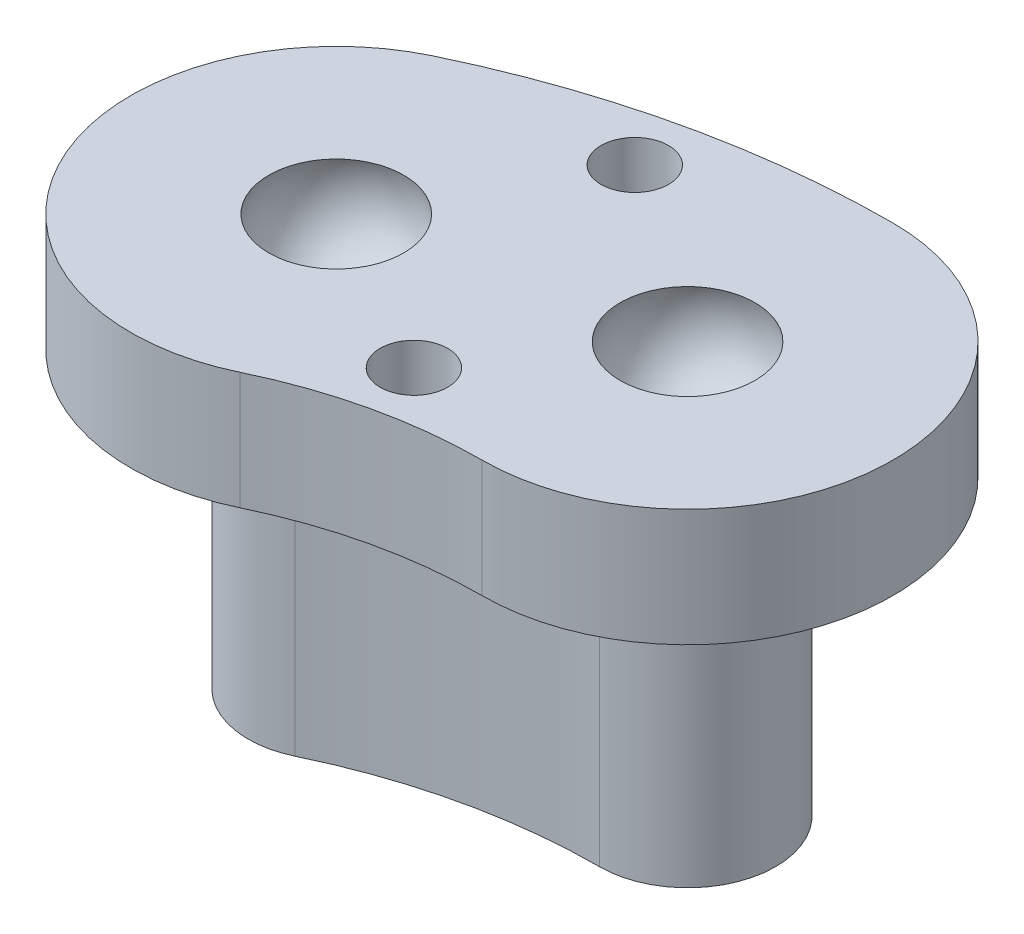
ISO-10303-21;
HEADER;
FILE_DESCRIPTION(('STEP AP214'),'2;1');
FILE_NAME('part.step','',(''),(''),'','','');
FILE_SCHEMA(('AUTOMOTIVE_DESIGN { 1 0 10303 214 1 1 1 1 }'));
ENDSEC;
DATA;
#1=APPLICATION_CONTEXT('core data for automotive mechanical design processes');
#2=APPLICATION_PROTOCOL_DEFINITION('international standard','automotive_design',2000,#1);
#3=PRODUCT_CONTEXT('',#1,'mechanical');
#4=PRODUCT('Part','Part','',(#3));
#5=PRODUCT_RELATED_PRODUCT_CATEGORY('part','',(#4));
#6=PRODUCT_DEFINITION_FORMATION('','',#4);
#7=PRODUCT_DEFINITION_CONTEXT('part definition',#1,'design');
#8=PRODUCT_DEFINITION('design','',#6,#7);
#9=PRODUCT_DEFINITION_SHAPE('','',#8);
#10=(LENGTH_UNIT() NAMED_UNIT(*) SI_UNIT(.MILLI.,.METRE.));
#11=(NAMED_UNIT(*) PLANE_ANGLE_UNIT() SI_UNIT($,.RADIAN.));
#12=(NAMED_UNIT(*) SI_UNIT($,.STERADIAN.) SOLID_ANGLE_UNIT());
#13=UNCERTAINTY_MEASURE_WITH_UNIT(LENGTH_MEASURE(1.E-05),#10,'distance_accuracy_value','');
#14=(GEOMETRIC_REPRESENTATION_CONTEXT(3) GLOBAL_UNCERTAINTY_ASSIGNED_CONTEXT((#13)) GLOBAL_UNIT_ASSIGNED_CONTEXT((#10,
#11,#12)) REPRESENTATION_CONTEXT('',''));
#15=CARTESIAN_POINT('',(0.,0.,0.));
#16=DIRECTION('',(0.,0.,1.));
#17=DIRECTION('',(1.,0.,0.));
#18=AXIS2_PLACEMENT_3D('',#15,#16,#17);
#19=CARTESIAN_POINT('',(0.,10.,-22.5));
#20=DIRECTION('',(0.,-1.,0.));
#21=DIRECTION('',(0.,0.,-1.));
#22=AXIS2_PLACEMENT_3D('',#19,#20,#21);
#23=CYLINDRICAL_SURFACE('',#22,3.);
#24=CARTESIAN_POINT('',(0.,0.,-22.5));
#25=DIRECTION('',(0.,1.,0.));
#26=DIRECTION('',(0.,0.,1.));
#27=AXIS2_PLACEMENT_3D('',#24,#25,#26);
#28=CIRCLE('',#27,3.);
#29=CARTESIAN_POINT('',(0.,0.,-19.5));
#30=VERTEX_POINT('',#29);
#31=CARTESIAN_POINT('',(0.,0.,-25.5));
#32=VERTEX_POINT('',#31);
#33=EDGE_CURVE('E138',#30,#32,#28,.T.);
#34=ORIENTED_EDGE('',*,*,#33,.T.);
#35=DIRECTION('',(0.,-1.,0.));
#36=VECTOR('',#35,1.);
#37=CARTESIAN_POINT('',(0.,10.,-25.5));
#38=LINE('',#37,#36);
#39=CARTESIAN_POINT('',(0.,10.,-25.5));
#40=VERTEX_POINT('',#39);
#41=EDGE_CURVE('E11',#40,#32,#38,.T.);
#42=ORIENTED_EDGE('',*,*,#41,.F.);
#43=CARTESIAN_POINT('',(0.,10.,-22.5));
#44=DIRECTION('',(0.,1.,0.));
#45=DIRECTION('',(0.,0.,1.));
#46=AXIS2_PLACEMENT_3D('',#43,#44,#45);
#47=CIRCLE('',#46,3.);
#48=CARTESIAN_POINT('',(0.,10.,-19.5));
#49=VERTEX_POINT('',#48);
#50=EDGE_CURVE('E147',#49,#40,#47,.T.);
#51=ORIENTED_EDGE('',*,*,#50,.F.);
#52=DIRECTION('',(0.,-1.,0.));
#53=VECTOR('',#52,1.);
#54=CARTESIAN_POINT('',(0.,10.,-19.5));
#55=LINE('',#54,#53);
#56=EDGE_CURVE('E156',#49,#30,#55,.T.);
#57=ORIENTED_EDGE('',*,*,#56,.T.);
#58=EDGE_LOOP('',(#34,#42,#51,#57));
#59=FACE_BOUND('',#58,.T.);
#60=ADVANCED_FACE('F38',(#59),#23,.T.);
#61=CARTESIAN_POINT('',(0.,10.,0.));
#62=DIRECTION('',(0.,-1.,0.));
#63=DIRECTION('',(0.,0.,-1.));
#64=AXIS2_PLACEMENT_3D('',#61,#62,#63);
#65=CYLINDRICAL_SURFACE('',#64,25.5);
#66=CARTESIAN_POINT('',(0.,0.,0.));
#67=DIRECTION('',(0.,1.,0.));
#68=DIRECTION('',(0.,0.,1.));
#69=AXIS2_PLACEMENT_3D('',#66,#67,#68);
#70=CIRCLE('',#69,25.5);
#71=CARTESIAN_POINT('',(-11.0499551544938,0.,-22.9814814814815));
#72=VERTEX_POINT('',#71);
#73=EDGE_CURVE('E141',#32,#72,#70,.T.);
#74=ORIENTED_EDGE('',*,*,#73,.T.);
#75=DIRECTION('',(0.,-1.,0.));
#76=VECTOR('',#75,1.);
#77=CARTESIAN_POINT('',(-11.0499551544938,10.,-22.9814814814815));
#78=LINE('',#77,#76);
#79=CARTESIAN_POINT('',(-11.0499551544938,10.,-22.9814814814815));
#80=VERTEX_POINT('',#79);
#81=EDGE_CURVE('E47',#80,#72,#78,.T.);
#82=ORIENTED_EDGE('',*,*,#81,.F.);
#83=CARTESIAN_POINT('',(0.,10.,0.));
#84=DIRECTION('',(0.,1.,0.));
#85=DIRECTION('',(0.,0.,1.));
#86=AXIS2_PLACEMENT_3D('',#83,#84,#85);
#87=CIRCLE('',#86,25.5);
#88=EDGE_CURVE('E82',#40,#80,#87,.T.);
#89=ORIENTED_EDGE('',*,*,#88,.F.);
#90=ORIENTED_EDGE('',*,*,#41,.T.);
#91=EDGE_LOOP('',(#74,#82,#89,#90));
#92=FACE_BOUND('',#91,.T.);
#93=ADVANCED_FACE('F210',(#92),#65,.T.);
#94=CARTESIAN_POINT('',(-9.74996043043569,10.,-20.2777777777778));
#95=DIRECTION('',(0.,-1.,0.));
#96=DIRECTION('',(0.,0.,-1.));
#97=AXIS2_PLACEMENT_3D('',#94,#95,#96);
#98=CYLINDRICAL_SURFACE('',#97,3.);
#99=CARTESIAN_POINT('',(-9.74996043043569,0.,-20.2777777777778));
#100=DIRECTION('',(0.,1.,0.));
#101=DIRECTION('',(0.,0.,1.));
#102=AXIS2_PLACEMENT_3D('',#99,#100,#101);
#103=CIRCLE('',#102,3.);
#104=CARTESIAN_POINT('',(-8.4499657063776,0.,-17.5740740740741));
#105=VERTEX_POINT('',#104);
#106=EDGE_CURVE('E72',#72,#105,#103,.T.);
#107=ORIENTED_EDGE('',*,*,#106,.T.);
#108=DIRECTION('',(0.,-1.,0.));
#109=VECTOR('',#108,1.);
#110=CARTESIAN_POINT('',(-8.4499657063776,10.,-17.5740740740741));
#111=LINE('',#110,#109);
#112=CARTESIAN_POINT('',(-8.4499657063776,10.,-17.5740740740741));
#113=VERTEX_POINT('',#112);
#114=EDGE_CURVE('E56',#113,#105,#111,.T.);
#115=ORIENTED_EDGE('',*,*,#114,.F.);
#116=CARTESIAN_POINT('',(-9.74996043043569,10.,-20.2777777777778));
#117=DIRECTION('',(0.,1.,0.));
#118=DIRECTION('',(0.,0.,1.));
#119=AXIS2_PLACEMENT_3D('',#116,#117,#118);
#120=CIRCLE('',#119,3.);
#121=EDGE_CURVE('E151',#80,#113,#120,.T.);
#122=ORIENTED_EDGE('',*,*,#121,.F.);
#123=ORIENTED_EDGE('',*,*,#81,.T.);
#124=EDGE_LOOP('',(#107,#115,#122,#123));
#125=FACE_BOUND('',#124,.T.);
#126=ADVANCED_FACE('F215',(#125),#98,.T.);
#127=CARTESIAN_POINT('',(0.,10.,0.));
#128=DIRECTION('',(0.,-1.,0.));
#129=DIRECTION('',(0.,0.,-1.));
#130=AXIS2_PLACEMENT_3D('',#127,#128,#129);
#131=CYLINDRICAL_SURFACE('',#130,19.5);
#132=CARTESIAN_POINT('',(0.,0.,0.));
#133=DIRECTION('',(0.,-1.,0.));
#134=DIRECTION('',(0.,0.,1.));
#135=AXIS2_PLACEMENT_3D('',#132,#133,#134);
#136=CIRCLE('',#135,19.5);
#137=EDGE_CURVE('E77',#105,#30,#136,.T.);
#138=ORIENTED_EDGE('',*,*,#137,.T.);
#139=ORIENTED_EDGE('',*,*,#56,.F.);
#140=CARTESIAN_POINT('',(0.,10.,0.));
#141=DIRECTION('',(0.,-1.,0.));
#142=DIRECTION('',(0.,0.,1.));
#143=AXIS2_PLACEMENT_3D('',#140,#141,#142);
#144=CIRCLE('',#143,19.5);
#145=EDGE_CURVE('E154',#113,#49,#144,.T.);
#146=ORIENTED_EDGE('',*,*,#145,.F.);
#147=ORIENTED_EDGE('',*,*,#114,.T.);
#148=EDGE_LOOP('',(#138,#139,#146,#147));
#149=FACE_BOUND('',#148,.T.);
#150=ADVANCED_FACE('F219',(#149),#131,.F.);
#151=CARTESIAN_POINT('',(0.,0.,-11.25));
#152=DIRECTION('',(0.,1.,0.));
#153=DIRECTION('',(0.,0.,1.));
#154=AXIS2_PLACEMENT_3D('',#151,#152,#153);
#155=PLANE('',#154);
#156=ORIENTED_EDGE('',*,*,#33,.F.);
#157=ORIENTED_EDGE('',*,*,#137,.F.);
#158=ORIENTED_EDGE('',*,*,#106,.F.);
#159=ORIENTED_EDGE('',*,*,#73,.F.);
#160=EDGE_LOOP('',(#156,#157,#158,#159));
#161=FACE_BOUND('',#160,.T.);
#162=ADVANCED_FACE('F218',(#161),#155,.F.);
#163=CARTESIAN_POINT('',(0.,10.,-11.25));
#164=DIRECTION('',(0.,1.,0.));
#165=DIRECTION('',(0.,0.,1.));
#166=AXIS2_PLACEMENT_3D('',#163,#164,#165);
#167=PLANE('',#166);
#168=CARTESIAN_POINT('',(-6.11111111111111,10.,-26.8123911836981));
#169=DIRECTION('',(0.,1.,0.));
#170=DIRECTION('',(0.,0.,1.));
#171=AXIS2_PLACEMENT_3D('',#168,#169,#170);
#172=CIRCLE('',#171,1.15);
#173=CARTESIAN_POINT('',(-6.11111111111111,10.,-25.6623911836981));
#174=VERTEX_POINT('',#173);
#175=EDGE_CURVE('E170',#174,#174,#172,.T.);
#176=ORIENTED_EDGE('',*,*,#175,.T.);
#177=EDGE_LOOP('',(#176));
#178=FACE_BOUND('',#177,.T.);
#179=CARTESIAN_POINT('',(-3.88888888888889,10.,-17.0624307532625));
#180=DIRECTION('',(0.,1.,0.));
#181=DIRECTION('',(0.,0.,1.));
#182=AXIS2_PLACEMENT_3D('',#179,#180,#181);
#183=CIRCLE('',#182,1.15);
#184=CARTESIAN_POINT('',(-3.88888888888889,10.,-15.9124307532625));
#185=VERTEX_POINT('',#184);
#186=EDGE_CURVE('E174',#185,#185,#183,.T.);
#187=ORIENTED_EDGE('',*,*,#186,.T.);
#188=EDGE_LOOP('',(#187));
#189=FACE_BOUND('',#188,.T.);
#190=CARTESIAN_POINT('',(0.,10.,-22.5));
#191=DIRECTION('',(0.,1.,0.));
#192=DIRECTION('',(0.,0.,1.));
#193=AXIS2_PLACEMENT_3D('',#190,#191,#192);
#194=CIRCLE('',#193,7.);
#195=CARTESIAN_POINT('',(0.,10.,-15.5));
#196=VERTEX_POINT('',#195);
#197=CARTESIAN_POINT('',(0.,10.,-29.5));
#198=VERTEX_POINT('',#197);
#199=EDGE_CURVE('E137',#196,#198,#194,.T.);
#200=ORIENTED_EDGE('',*,*,#199,.F.);
#201=CARTESIAN_POINT('',(0.,10.,0.));
#202=DIRECTION('',(0.,-1.,0.));
#203=DIRECTION('',(0.,0.,1.));
#204=AXIS2_PLACEMENT_3D('',#201,#202,#203);
#205=CIRCLE('',#204,15.5);
#206=CARTESIAN_POINT('',(-6.71663940763348,10.,-13.9691358024691));
#207=VERTEX_POINT('',#206);
#208=EDGE_CURVE('E133',#207,#196,#205,.T.);
#209=ORIENTED_EDGE('',*,*,#208,.F.);
#210=CARTESIAN_POINT('',(-9.74996043043569,10.,-20.2777777777778));
#211=DIRECTION('',(0.,1.,0.));
#212=DIRECTION('',(0.,0.,1.));
#213=AXIS2_PLACEMENT_3D('',#210,#211,#212);
#214=CIRCLE('',#213,7.);
#215=CARTESIAN_POINT('',(-12.7832814532379,10.,-26.5864197530864));
#216=VERTEX_POINT('',#215);
#217=EDGE_CURVE('E187',#216,#207,#214,.T.);
#218=ORIENTED_EDGE('',*,*,#217,.F.);
#219=CARTESIAN_POINT('',(0.,10.,0.));
#220=DIRECTION('',(0.,1.,0.));
#221=DIRECTION('',(0.,0.,1.));
#222=AXIS2_PLACEMENT_3D('',#219,#220,#221);
#223=CIRCLE('',#222,29.5);
#224=EDGE_CURVE('E167',#198,#216,#223,.T.);
#225=ORIENTED_EDGE('',*,*,#224,.F.);
#226=EDGE_LOOP('',(#200,#209,#218,#225));
#227=FACE_BOUND('',#226,.T.);
#228=ORIENTED_EDGE('',*,*,#145,.T.);
#229=ORIENTED_EDGE('',*,*,#50,.T.);
#230=ORIENTED_EDGE('',*,*,#88,.T.);
#231=ORIENTED_EDGE('',*,*,#121,.T.);
#232=EDGE_LOOP('',(#228,#229,#230,#231));
#233=FACE_BOUND('',#232,.T.);
#234=ADVANCED_FACE('F198',(#178,#189,#227,#233),#167,.F.);
#235=CARTESIAN_POINT('',(0.,14.,-22.5));
#236=DIRECTION('',(0.,-1.,0.));
#237=DIRECTION('',(0.,0.,-1.));
#238=AXIS2_PLACEMENT_3D('',#235,#236,#237);
#239=CYLINDRICAL_SURFACE('',#238,7.);
#240=ORIENTED_EDGE('',*,*,#199,.T.);
#241=DIRECTION('',(0.,-1.,0.));
#242=VECTOR('',#241,1.);
#243=CARTESIAN_POINT('',(0.,14.,-29.5));
#244=LINE('',#243,#242);
#245=CARTESIAN_POINT('',(0.,14.,-29.5));
#246=VERTEX_POINT('',#245);
#247=EDGE_CURVE('E117',#246,#198,#244,.T.);
#248=ORIENTED_EDGE('',*,*,#247,.F.);
#249=CARTESIAN_POINT('',(0.,14.,-22.5));
#250=DIRECTION('',(0.,1.,0.));
#251=DIRECTION('',(0.,0.,1.));
#252=AXIS2_PLACEMENT_3D('',#249,#250,#251);
#253=CIRCLE('',#252,7.);
#254=CARTESIAN_POINT('',(0.,14.,-15.5));
#255=VERTEX_POINT('',#254);
#256=EDGE_CURVE('E124',#255,#246,#253,.T.);
#257=ORIENTED_EDGE('',*,*,#256,.F.);
#258=DIRECTION('',(0.,-1.,0.));
#259=VECTOR('',#258,1.);
#260=CARTESIAN_POINT('',(0.,14.,-15.5));
#261=LINE('',#260,#259);
#262=EDGE_CURVE('E184',#255,#196,#261,.T.);
#263=ORIENTED_EDGE('',*,*,#262,.T.);
#264=EDGE_LOOP('',(#240,#248,#257,#263));
#265=FACE_BOUND('',#264,.T.);
#266=ADVANCED_FACE('F135',(#265),#239,.T.);
#267=CARTESIAN_POINT('',(0.,14.,0.));
#268=DIRECTION('',(0.,-1.,0.));
#269=DIRECTION('',(0.,0.,-1.));
#270=AXIS2_PLACEMENT_3D('',#267,#268,#269);
#271=CYLINDRICAL_SURFACE('',#270,29.5);
#272=ORIENTED_EDGE('',*,*,#224,.T.);
#273=DIRECTION('',(0.,-1.,0.));
#274=VECTOR('',#273,1.);
#275=CARTESIAN_POINT('',(-12.7832814532379,14.,-26.5864197530864));
#276=LINE('',#275,#274);
#277=CARTESIAN_POINT('',(-12.7832814532379,14.,-26.5864197530864));
#278=VERTEX_POINT('',#277);
#279=EDGE_CURVE('E120',#278,#216,#276,.T.);
#280=ORIENTED_EDGE('',*,*,#279,.F.);
#281=CARTESIAN_POINT('',(0.,14.,0.));
#282=DIRECTION('',(0.,1.,0.));
#283=DIRECTION('',(0.,0.,1.));
#284=AXIS2_PLACEMENT_3D('',#281,#282,#283);
#285=CIRCLE('',#284,29.5);
#286=EDGE_CURVE('E113',#246,#278,#285,.T.);
#287=ORIENTED_EDGE('',*,*,#286,.F.);
#288=ORIENTED_EDGE('',*,*,#247,.T.);
#289=EDGE_LOOP('',(#272,#280,#287,#288));
#290=FACE_BOUND('',#289,.T.);
#291=ADVANCED_FACE('F115',(#290),#271,.T.);
#292=CARTESIAN_POINT('',(-9.74996043043569,14.,-20.2777777777778));
#293=DIRECTION('',(0.,-1.,0.));
#294=DIRECTION('',(0.,0.,-1.));
#295=AXIS2_PLACEMENT_3D('',#292,#293,#294);
#296=CYLINDRICAL_SURFACE('',#295,7.);
#297=ORIENTED_EDGE('',*,*,#217,.T.);
#298=DIRECTION('',(0.,-1.,0.));
#299=VECTOR('',#298,1.);
#300=CARTESIAN_POINT('',(-6.71663940763348,14.,-13.9691358024691));
#301=LINE('',#300,#299);
#302=CARTESIAN_POINT('',(-6.71663940763348,14.,-13.9691358024691));
#303=VERTEX_POINT('',#302);
#304=EDGE_CURVE('E143',#303,#207,#301,.T.);
#305=ORIENTED_EDGE('',*,*,#304,.F.);
#306=CARTESIAN_POINT('',(-9.74996043043569,14.,-20.2777777777778));
#307=DIRECTION('',(0.,1.,0.));
#308=DIRECTION('',(0.,0.,1.));
#309=AXIS2_PLACEMENT_3D('',#306,#307,#308);
#310=CIRCLE('',#309,7.);
#311=EDGE_CURVE('E123',#278,#303,#310,.T.);
#312=ORIENTED_EDGE('',*,*,#311,.F.);
#313=ORIENTED_EDGE('',*,*,#279,.T.);
#314=EDGE_LOOP('',(#297,#305,#312,#313));
#315=FACE_BOUND('',#314,.T.);
#316=ADVANCED_FACE('F200',(#315),#296,.T.);
#317=CARTESIAN_POINT('',(0.,14.,0.));
#318=DIRECTION('',(0.,-1.,0.));
#319=DIRECTION('',(0.,0.,-1.));
#320=AXIS2_PLACEMENT_3D('',#317,#318,#319);
#321=CYLINDRICAL_SURFACE('',#320,15.5);
#322=ORIENTED_EDGE('',*,*,#208,.T.);
#323=ORIENTED_EDGE('',*,*,#262,.F.);
#324=CARTESIAN_POINT('',(0.,14.,0.));
#325=DIRECTION('',(0.,-1.,0.));
#326=DIRECTION('',(0.,0.,1.));
#327=AXIS2_PLACEMENT_3D('',#324,#325,#326);
#328=CIRCLE('',#327,15.5);
#329=EDGE_CURVE('E129',#303,#255,#328,.T.);
#330=ORIENTED_EDGE('',*,*,#329,.F.);
#331=ORIENTED_EDGE('',*,*,#304,.T.);
#332=EDGE_LOOP('',(#322,#323,#330,#331));
#333=FACE_BOUND('',#332,.T.);
#334=ADVANCED_FACE('F194',(#333),#321,.F.);
#335=CARTESIAN_POINT('',(0.,14.,-11.25));
#336=DIRECTION('',(0.,1.,0.));
#337=DIRECTION('',(0.,0.,1.));
#338=AXIS2_PLACEMENT_3D('',#335,#336,#337);
#339=PLANE('',#338);
#340=CARTESIAN_POINT('',(-6.11111111111111,14.,-26.8123911836981));
#341=DIRECTION('',(0.,1.,0.));
#342=DIRECTION('',(0.,0.,1.));
#343=AXIS2_PLACEMENT_3D('',#340,#341,#342);
#344=CIRCLE('',#343,1.15);
#345=CARTESIAN_POINT('',(-6.11111111111111,14.,-25.6623911836981));
#346=VERTEX_POINT('',#345);
#347=EDGE_CURVE('E179',#346,#346,#344,.T.);
#348=ORIENTED_EDGE('',*,*,#347,.F.);
#349=EDGE_LOOP('',(#348));
#350=FACE_BOUND('',#349,.T.);
#351=CARTESIAN_POINT('',(-3.88888888888889,14.,-17.0624307532625));
#352=DIRECTION('',(0.,1.,0.));
#353=DIRECTION('',(0.,0.,1.));
#354=AXIS2_PLACEMENT_3D('',#351,#352,#353);
#355=CIRCLE('',#354,1.15);
#356=CARTESIAN_POINT('',(-3.88888888888889,14.,-15.9124307532625));
#357=VERTEX_POINT('',#356);
#358=EDGE_CURVE('E259',#357,#357,#355,.T.);
#359=ORIENTED_EDGE('',*,*,#358,.F.);
#360=EDGE_LOOP('',(#359));
#361=FACE_BOUND('',#360,.T.);
#362=CARTESIAN_POINT('',(0.,14.,-22.5));
#363=DIRECTION('',(0.,1.,0.));
#364=DIRECTION('',(0.,0.,1.));
#365=AXIS2_PLACEMENT_3D('',#362,#363,#364);
#366=CIRCLE('',#365,2.29782505861521);
#367=CARTESIAN_POINT('',(0.,14.,-20.2021749413848));
#368=VERTEX_POINT('',#367);
#369=EDGE_CURVE('E41',#368,#368,#366,.T.);
#370=ORIENTED_EDGE('',*,*,#369,.F.);
#371=EDGE_LOOP('',(#370));
#372=FACE_BOUND('',#371,.T.);
#373=CARTESIAN_POINT('',(-9.74996043043569,14.,-20.2777777777778));
#374=DIRECTION('',(0.,1.,0.));
#375=DIRECTION('',(0.,0.,1.));
#376=AXIS2_PLACEMENT_3D('',#373,#374,#375);
#377=CIRCLE('',#376,2.29782505861521);
#378=CARTESIAN_POINT('',(-9.74996043043569,14.,-17.9799527191626));
#379=VERTEX_POINT('',#378);
#380=EDGE_CURVE('E163',#379,#379,#377,.T.);
#381=ORIENTED_EDGE('',*,*,#380,.F.);
#382=EDGE_LOOP('',(#381));
#383=FACE_BOUND('',#382,.T.);
#384=ORIENTED_EDGE('',*,*,#256,.T.);
#385=ORIENTED_EDGE('',*,*,#286,.T.);
#386=ORIENTED_EDGE('',*,*,#311,.T.);
#387=ORIENTED_EDGE('',*,*,#329,.T.);
#388=EDGE_LOOP('',(#384,#385,#386,#387));
#389=FACE_BOUND('',#388,.T.);
#390=ADVANCED_FACE('F127',(#350,#361,#372,#383,#389),#339,.T.);
#391=CARTESIAN_POINT('',(-9.74996043043569,13.15,-20.2777777777778));
#392=DIRECTION('',(0.,0.,-1.));
#393=DIRECTION('',(1.,0.,0.));
#394=AXIS2_PLACEMENT_3D('',#391,#392,#393);
#395=SPHERICAL_SURFACE('',#394,2.45);
#396=CARTESIAN_POINT('',(-9.74996043043569,13.15,-20.2777777777778));
#397=DIRECTION('',(0.,1.,0.));
#398=DIRECTION('',(0.,0.,1.));
#399=AXIS2_PLACEMENT_3D('',#396,#397,#398);
#400=SPHERICAL_SURFACE('',#399,2.45);
#401=ORIENTED_EDGE('',*,*,#380,.T.);
#402=EDGE_LOOP('',(#401));
#403=FACE_BOUND('',#402,.T.);
#404=ADVANCED_FACE('F240',(#403),#400,.F.);
#405=CARTESIAN_POINT('',(0.,13.15,-22.5));
#406=DIRECTION('',(0.,0.,-1.));
#407=DIRECTION('',(-1.,0.,0.));
#408=AXIS2_PLACEMENT_3D('',#405,#406,#407);
#409=SPHERICAL_SURFACE('',#408,2.45);
#410=CARTESIAN_POINT('',(0.,13.15,-22.5));
#411=DIRECTION('',(0.,1.,0.));
#412=DIRECTION('',(0.,0.,1.));
#413=AXIS2_PLACEMENT_3D('',#410,#411,#412);
#414=SPHERICAL_SURFACE('',#413,2.45);
#415=ORIENTED_EDGE('',*,*,#369,.T.);
#416=EDGE_LOOP('',(#415));
#417=FACE_BOUND('',#416,.T.);
#418=ADVANCED_FACE('F244',(#417),#414,.F.);
#419=CARTESIAN_POINT('',(-3.88888888888889,4.,-17.0624307532625));
#420=DIRECTION('',(0.,1.,0.));
#421=DIRECTION('',(0.,0.,1.));
#422=AXIS2_PLACEMENT_3D('',#419,#420,#421);
#423=CYLINDRICAL_SURFACE('',#422,1.15);
#424=ORIENTED_EDGE('',*,*,#358,.T.);
#425=EDGE_LOOP('',(#424));
#426=FACE_BOUND('',#425,.T.);
#427=ORIENTED_EDGE('',*,*,#186,.F.);
#428=EDGE_LOOP('',(#427));
#429=FACE_BOUND('',#428,.T.);
#430=ADVANCED_FACE('F247',(#426,#429),#423,.F.);
#431=CARTESIAN_POINT('',(-6.11111111111111,4.,-26.8123911836981));
#432=DIRECTION('',(0.,1.,0.));
#433=DIRECTION('',(0.,0.,1.));
#434=AXIS2_PLACEMENT_3D('',#431,#432,#433);
#435=CYLINDRICAL_SURFACE('',#434,1.15);
#436=ORIENTED_EDGE('',*,*,#347,.T.);
#437=EDGE_LOOP('',(#436));
#438=FACE_BOUND('',#437,.T.);
#439=ORIENTED_EDGE('',*,*,#175,.F.);
#440=EDGE_LOOP('',(#439));
#441=FACE_BOUND('',#440,.T.);
#442=ADVANCED_FACE('F250',(#438,#441),#435,.F.);
#443=CLOSED_SHELL('',(#60,#93,#126,#150,#162,#234,#266,#291,#316,#334,#390,#404,#418,#430,#442));
#444=MANIFOLD_SOLID_BREP('B2',#443);
#445=ADVANCED_BREP_SHAPE_REPRESENTATION('',(#18,#444),#14);
#446=SHAPE_DEFINITION_REPRESENTATION(#9,#445);
ENDSEC;
END-ISO-10303-21;
